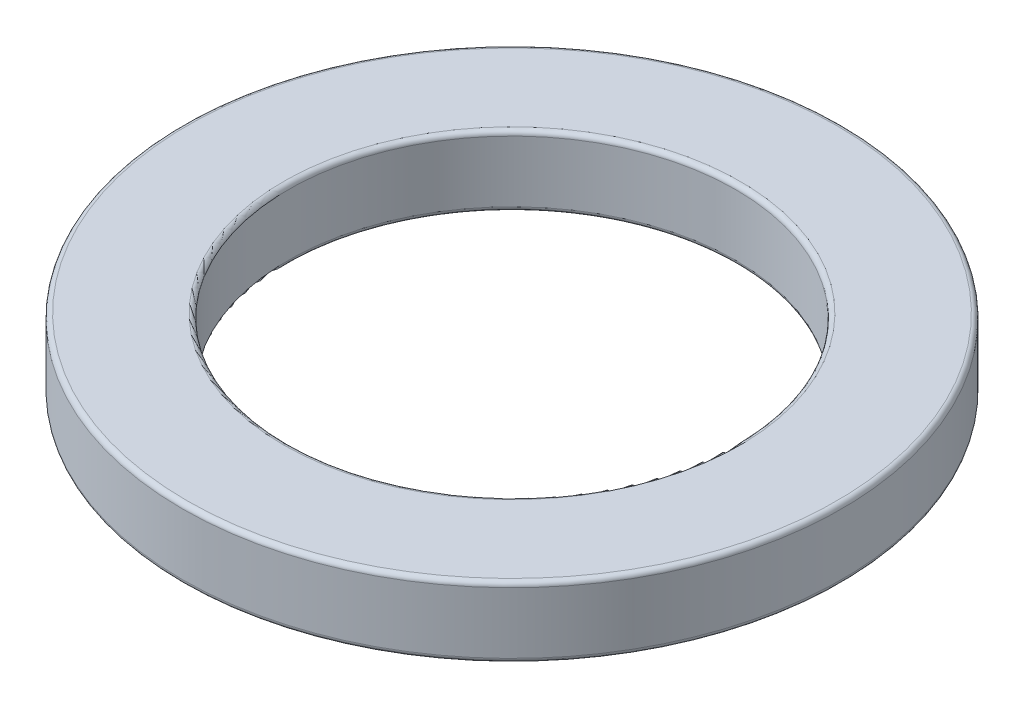
ISO-10303-21;
HEADER;
FILE_DESCRIPTION(('STEP AP214'),'2;1');
FILE_NAME('part.step','',(''),(''),'','','');
FILE_SCHEMA(('AUTOMOTIVE_DESIGN { 1 0 10303 214 1 1 1 1 }'));
ENDSEC;
DATA;
#1=APPLICATION_CONTEXT('core data for automotive mechanical design processes');
#2=APPLICATION_PROTOCOL_DEFINITION('international standard','automotive_design',2000,#1);
#3=PRODUCT_CONTEXT('',#1,'mechanical');
#4=PRODUCT('Part','Part','',(#3));
#5=PRODUCT_RELATED_PRODUCT_CATEGORY('part','',(#4));
#6=PRODUCT_DEFINITION_FORMATION('','',#4);
#7=PRODUCT_DEFINITION_CONTEXT('part definition',#1,'design');
#8=PRODUCT_DEFINITION('design','',#6,#7);
#9=PRODUCT_DEFINITION_SHAPE('','',#8);
#10=(LENGTH_UNIT() NAMED_UNIT(*) SI_UNIT(.MILLI.,.METRE.));
#11=(NAMED_UNIT(*) PLANE_ANGLE_UNIT() SI_UNIT($,.RADIAN.));
#12=(NAMED_UNIT(*) SI_UNIT($,.STERADIAN.) SOLID_ANGLE_UNIT());
#13=UNCERTAINTY_MEASURE_WITH_UNIT(LENGTH_MEASURE(1.E-05),#10,'distance_accuracy_value','');
#14=(GEOMETRIC_REPRESENTATION_CONTEXT(3) GLOBAL_UNCERTAINTY_ASSIGNED_CONTEXT((#13)) GLOBAL_UNIT_ASSIGNED_CONTEXT((#10,
#11,#12)) REPRESENTATION_CONTEXT('',''));
#15=CARTESIAN_POINT('',(0.,0.,0.));
#16=DIRECTION('',(0.,0.,1.));
#17=DIRECTION('',(1.,0.,0.));
#18=AXIS2_PLACEMENT_3D('',#15,#16,#17);
#19=CARTESIAN_POINT('',(0.,3.,0.));
#20=DIRECTION('',(0.,1.,0.));
#21=DIRECTION('',(0.,0.,1.));
#22=AXIS2_PLACEMENT_3D('',#19,#20,#21);
#23=PLANE('',#22);
#24=CARTESIAN_POINT('',(0.,3.,0.));
#25=DIRECTION('',(0.,1.,0.));
#26=DIRECTION('',(0.,0.,1.));
#27=AXIS2_PLACEMENT_3D('',#24,#25,#26);
#28=CIRCLE('',#27,9.7);
#29=CARTESIAN_POINT('',(0.,3.,9.7));
#30=VERTEX_POINT('',#29);
#31=EDGE_CURVE('E10',#30,#30,#28,.F.);
#32=ORIENTED_EDGE('',*,*,#31,.T.);
#33=EDGE_LOOP('',(#32));
#34=FACE_BOUND('',#33,.T.);
#35=CARTESIAN_POINT('',(0.,3.,0.));
#36=DIRECTION('',(0.,1.,0.));
#37=DIRECTION('',(0.,0.,1.));
#38=AXIS2_PLACEMENT_3D('',#35,#36,#37);
#39=CIRCLE('',#38,13.8);
#40=CARTESIAN_POINT('',(0.,3.,13.8));
#41=VERTEX_POINT('',#40);
#42=EDGE_CURVE('E38',#41,#41,#39,.T.);
#43=ORIENTED_EDGE('',*,*,#42,.T.);
#44=EDGE_LOOP('',(#43));
#45=FACE_BOUND('',#44,.T.);
#46=ADVANCED_FACE('F31',(#34,#45),#23,.T.);
#47=CARTESIAN_POINT('',(0.,0.,0.));
#48=DIRECTION('',(0.,1.,0.));
#49=DIRECTION('',(0.,0.,1.));
#50=AXIS2_PLACEMENT_3D('',#47,#48,#49);
#51=PLANE('',#50);
#52=CARTESIAN_POINT('',(0.,0.,0.));
#53=DIRECTION('',(0.,1.,0.));
#54=DIRECTION('',(0.,0.,1.));
#55=AXIS2_PLACEMENT_3D('',#52,#53,#54);
#56=CIRCLE('',#55,9.7);
#57=CARTESIAN_POINT('',(0.,0.,9.7));
#58=VERTEX_POINT('',#57);
#59=EDGE_CURVE('E57',#58,#58,#56,.T.);
#60=ORIENTED_EDGE('',*,*,#59,.T.);
#61=EDGE_LOOP('',(#60));
#62=FACE_BOUND('',#61,.T.);
#63=CARTESIAN_POINT('',(0.,0.,0.));
#64=DIRECTION('',(0.,1.,0.));
#65=DIRECTION('',(0.,0.,1.));
#66=AXIS2_PLACEMENT_3D('',#63,#64,#65);
#67=CIRCLE('',#66,13.8);
#68=CARTESIAN_POINT('',(0.,0.,13.8));
#69=VERTEX_POINT('',#68);
#70=EDGE_CURVE('E60',#69,#69,#67,.F.);
#71=ORIENTED_EDGE('',*,*,#70,.T.);
#72=EDGE_LOOP('',(#71));
#73=FACE_BOUND('',#72,.T.);
#74=ADVANCED_FACE('F64',(#62,#73),#51,.F.);
#75=CARTESIAN_POINT('',(0.,3.,0.));
#76=DIRECTION('',(0.,-1.,0.));
#77=DIRECTION('',(0.,0.,-1.));
#78=AXIS2_PLACEMENT_3D('',#75,#76,#77);
#79=CYLINDRICAL_SURFACE('',#78,14.);
#80=CARTESIAN_POINT('',(0.,0.2,0.));
#81=DIRECTION('',(0.,1.,0.));
#82=DIRECTION('',(0.,0.,1.));
#83=AXIS2_PLACEMENT_3D('',#80,#81,#82);
#84=CIRCLE('',#83,14.);
#85=CARTESIAN_POINT('',(0.,0.2,14.));
#86=VERTEX_POINT('',#85);
#87=EDGE_CURVE('E42',#86,#86,#84,.T.);
#88=ORIENTED_EDGE('',*,*,#87,.T.);
#89=EDGE_LOOP('',(#88));
#90=FACE_BOUND('',#89,.T.);
#91=CARTESIAN_POINT('',(0.,2.8,0.));
#92=DIRECTION('',(0.,1.,0.));
#93=DIRECTION('',(0.,0.,1.));
#94=AXIS2_PLACEMENT_3D('',#91,#92,#93);
#95=CIRCLE('',#94,14.);
#96=CARTESIAN_POINT('',(0.,2.8,14.));
#97=VERTEX_POINT('',#96);
#98=EDGE_CURVE('E46',#97,#97,#95,.F.);
#99=ORIENTED_EDGE('',*,*,#98,.T.);
#100=EDGE_LOOP('',(#99));
#101=FACE_BOUND('',#100,.T.);
#102=ADVANCED_FACE('F74',(#90,#101),#79,.T.);
#103=CARTESIAN_POINT('',(0.,3.,0.));
#104=DIRECTION('',(0.,-1.,0.));
#105=DIRECTION('',(0.,0.,-1.));
#106=AXIS2_PLACEMENT_3D('',#103,#104,#105);
#107=CYLINDRICAL_SURFACE('',#106,9.5);
#108=CARTESIAN_POINT('',(0.,0.2,0.));
#109=DIRECTION('',(0.,1.,0.));
#110=DIRECTION('',(0.,0.,1.));
#111=AXIS2_PLACEMENT_3D('',#108,#109,#110);
#112=CIRCLE('',#111,9.5);
#113=CARTESIAN_POINT('',(0.,0.2,9.5));
#114=VERTEX_POINT('',#113);
#115=EDGE_CURVE('E51',#114,#114,#112,.F.);
#116=ORIENTED_EDGE('',*,*,#115,.T.);
#117=EDGE_LOOP('',(#116));
#118=FACE_BOUND('',#117,.T.);
#119=CARTESIAN_POINT('',(0.,2.8,0.));
#120=DIRECTION('',(0.,1.,0.));
#121=DIRECTION('',(0.,0.,1.));
#122=AXIS2_PLACEMENT_3D('',#119,#120,#121);
#123=CIRCLE('',#122,9.5);
#124=CARTESIAN_POINT('',(0.,2.8,9.5));
#125=VERTEX_POINT('',#124);
#126=EDGE_CURVE('E54',#125,#125,#123,.T.);
#127=ORIENTED_EDGE('',*,*,#126,.T.);
#128=EDGE_LOOP('',(#127));
#129=FACE_BOUND('',#128,.T.);
#130=ADVANCED_FACE('F77',(#118,#129),#107,.F.);
#131=CARTESIAN_POINT('',(0.,0.2,0.));
#132=DIRECTION('',(0.,1.,0.));
#133=DIRECTION('',(0.,0.,1.));
#134=AXIS2_PLACEMENT_3D('',#131,#132,#133);
#135=TOROIDAL_SURFACE('',#134,9.7,0.2);
#136=ORIENTED_EDGE('',*,*,#115,.F.);
#137=EDGE_LOOP('',(#136));
#138=FACE_BOUND('',#137,.T.);
#139=ORIENTED_EDGE('',*,*,#59,.F.);
#140=EDGE_LOOP('',(#139));
#141=FACE_BOUND('',#140,.T.);
#142=ADVANCED_FACE('F70',(#138,#141),#135,.T.);
#143=CARTESIAN_POINT('',(0.,0.2,0.));
#144=DIRECTION('',(0.,1.,0.));
#145=DIRECTION('',(0.,0.,1.));
#146=AXIS2_PLACEMENT_3D('',#143,#144,#145);
#147=TOROIDAL_SURFACE('',#146,13.8,0.2);
#148=ORIENTED_EDGE('',*,*,#70,.F.);
#149=EDGE_LOOP('',(#148));
#150=FACE_BOUND('',#149,.T.);
#151=ORIENTED_EDGE('',*,*,#87,.F.);
#152=EDGE_LOOP('',(#151));
#153=FACE_BOUND('',#152,.T.);
#154=ADVANCED_FACE('F66',(#150,#153),#147,.T.);
#155=CARTESIAN_POINT('',(0.,2.8,0.));
#156=DIRECTION('',(0.,1.,0.));
#157=DIRECTION('',(0.,0.,1.));
#158=AXIS2_PLACEMENT_3D('',#155,#156,#157);
#159=TOROIDAL_SURFACE('',#158,9.7,0.2);
#160=ORIENTED_EDGE('',*,*,#31,.F.);
#161=EDGE_LOOP('',(#160));
#162=FACE_BOUND('',#161,.T.);
#163=ORIENTED_EDGE('',*,*,#126,.F.);
#164=EDGE_LOOP('',(#163));
#165=FACE_BOUND('',#164,.T.);
#166=ADVANCED_FACE('F69',(#162,#165),#159,.T.);
#167=CARTESIAN_POINT('',(0.,2.8,0.));
#168=DIRECTION('',(0.,1.,0.));
#169=DIRECTION('',(0.,0.,1.));
#170=AXIS2_PLACEMENT_3D('',#167,#168,#169);
#171=TOROIDAL_SURFACE('',#170,13.8,0.2);
#172=ORIENTED_EDGE('',*,*,#98,.F.);
#173=EDGE_LOOP('',(#172));
#174=FACE_BOUND('',#173,.T.);
#175=ORIENTED_EDGE('',*,*,#42,.F.);
#176=EDGE_LOOP('',(#175));
#177=FACE_BOUND('',#176,.T.);
#178=ADVANCED_FACE('F33',(#174,#177),#171,.T.);
#179=CLOSED_SHELL('',(#46,#74,#102,#130,#142,#154,#166,#178));
#180=MANIFOLD_SOLID_BREP('B2',#179);
#181=ADVANCED_BREP_SHAPE_REPRESENTATION('',(#18,#180),#14);
#182=SHAPE_DEFINITION_REPRESENTATION(#9,#181);
ENDSEC;
END-ISO-10303-21;
